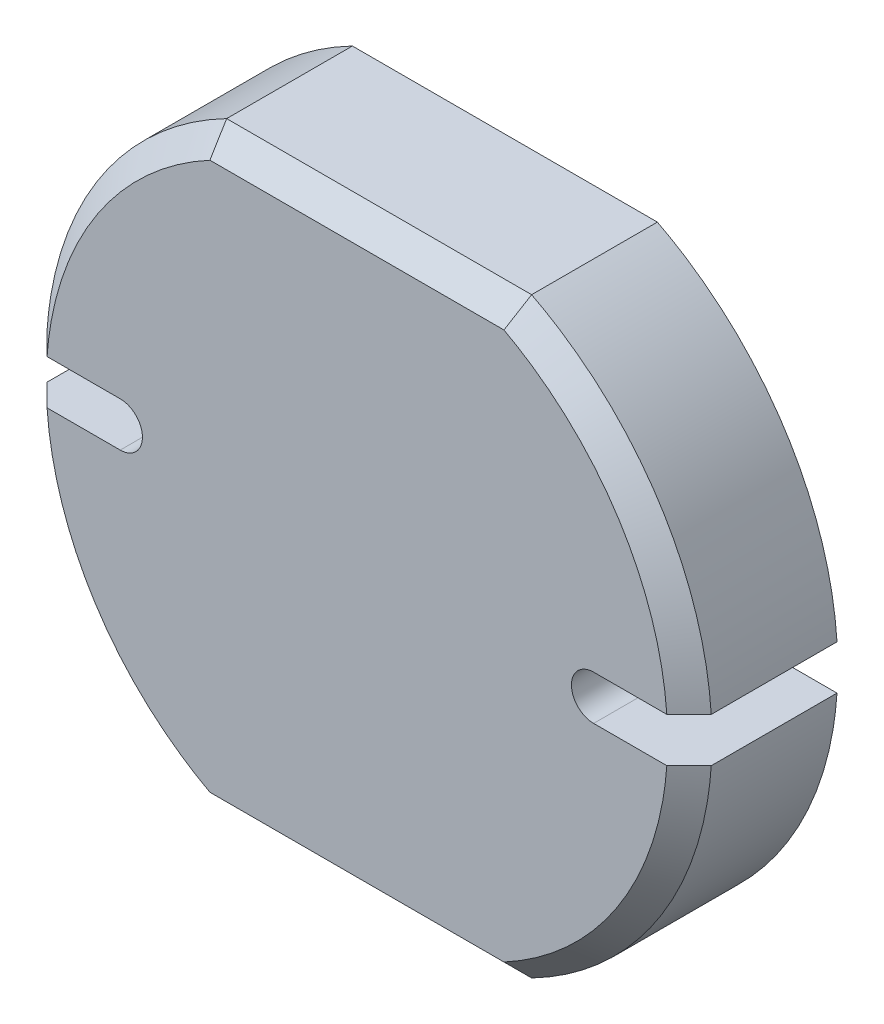
ISO-10303-21;
HEADER;
FILE_DESCRIPTION(('STEP AP214'),'2;1');
FILE_NAME('part.step','',(''),(''),'','','');
FILE_SCHEMA(('AUTOMOTIVE_DESIGN { 1 0 10303 214 1 1 1 1 }'));
ENDSEC;
DATA;
#1=APPLICATION_CONTEXT('core data for automotive mechanical design processes');
#2=APPLICATION_PROTOCOL_DEFINITION('international standard','automotive_design',2000,#1);
#3=PRODUCT_CONTEXT('',#1,'mechanical');
#4=PRODUCT('Part','Part','',(#3));
#5=PRODUCT_RELATED_PRODUCT_CATEGORY('part','',(#4));
#6=PRODUCT_DEFINITION_FORMATION('','',#4);
#7=PRODUCT_DEFINITION_CONTEXT('part definition',#1,'design');
#8=PRODUCT_DEFINITION('design','',#6,#7);
#9=PRODUCT_DEFINITION_SHAPE('','',#8);
#10=(LENGTH_UNIT() NAMED_UNIT(*) SI_UNIT(.MILLI.,.METRE.));
#11=(NAMED_UNIT(*) PLANE_ANGLE_UNIT() SI_UNIT($,.RADIAN.));
#12=(NAMED_UNIT(*) SI_UNIT($,.STERADIAN.) SOLID_ANGLE_UNIT());
#13=UNCERTAINTY_MEASURE_WITH_UNIT(LENGTH_MEASURE(1.E-05),#10,'distance_accuracy_value','');
#14=(GEOMETRIC_REPRESENTATION_CONTEXT(3) GLOBAL_UNCERTAINTY_ASSIGNED_CONTEXT((#13)) GLOBAL_UNIT_ASSIGNED_CONTEXT((#10,
#11,#12)) REPRESENTATION_CONTEXT('',''));
#15=CARTESIAN_POINT('',(0.,0.,0.));
#16=DIRECTION('',(0.,0.,1.));
#17=DIRECTION('',(1.,0.,0.));
#18=AXIS2_PLACEMENT_3D('',#15,#16,#17);
#19=CARTESIAN_POINT('',(-2.095328136594,0.139999999998,3.225));
#20=CARTESIAN_POINT('',(-2.244994432065,0.149999999998,3.075));
#21=CARTESIAN_POINT('',(-2.016262776784,1.32334195029,3.225));
#22=CARTESIAN_POINT('',(-2.160281546554,1.41786637531,3.075));
#23=CARTESIAN_POINT('',(-0.962057979311,1.866666666667,3.225));
#24=CARTESIAN_POINT('',(-1.030776406405,2.,3.075));
#25=(BOUNDED_SURFACE() B_SPLINE_SURFACE(2,1,((#19,#20),(#21,#22),(#23,#24)),.UNSPECIFIED.,.F.,
.F.,.F.) B_SPLINE_SURFACE_WITH_KNOTS((3,3),(2,2),(5.254987378455,6.28318530718),
(-0.212132034356,0.),
.UNSPECIFIED.) GEOMETRIC_REPRESENTATION_ITEM() RATIONAL_B_SPLINE_SURFACE(((1.,1.),
(0.87073616041,0.87073616041),(1.,1.))) REPRESENTATION_ITEM('') SURFACE());
#26=CARTESIAN_POINT('',(-1.030776406404,2.,3.075));
#27=CARTESIAN_POINT('',(-1.012253376061,1.923627589388,3.151372410612));
#28=CARTESIAN_POINT('',(-0.993730345718,1.85,3.225));
#29=(BOUNDED_CURVE() B_SPLINE_CURVE(2,(#26,#27,#28),.UNSPECIFIED.,.F.,
.F.) B_SPLINE_CURVE_WITH_KNOTS((3,3),(-1.030776406404,-0.993730345718),
.UNSPECIFIED.) CURVE() GEOMETRIC_REPRESENTATION_ITEM() RATIONAL_B_SPLINE_CURVE((1.,1.,1.)) REPRESENTATION_ITEM(''));
#30=CARTESIAN_POINT('',(-1.030776406404,2.,3.075));
#31=VERTEX_POINT('',#30);
#32=CARTESIAN_POINT('',(-0.993730345718,1.85,3.225));
#33=VERTEX_POINT('',#32);
#34=EDGE_CURVE('E11',#31,#33,#29,.T.);
#35=CARTESIAN_POINT('',(-1.030776406405,2.,3.075));
#36=CARTESIAN_POINT('',(-2.160281546554,1.41786637531,3.075));
#37=CARTESIAN_POINT('',(-2.244994432064,0.149999999998,3.075));
#38=(BOUNDED_CURVE() B_SPLINE_CURVE(2,(#35,#36,#37),.UNSPECIFIED.,.F.,
.F.) B_SPLINE_CURVE_WITH_KNOTS((3,3),(0.,1.028197928725),
.UNSPECIFIED.) CURVE() GEOMETRIC_REPRESENTATION_ITEM() RATIONAL_B_SPLINE_CURVE((1.,
0.87073616041,1.)) REPRESENTATION_ITEM(''));
#39=CARTESIAN_POINT('',(-2.244994432064,0.149999999998,3.075));
#40=VERTEX_POINT('',#39);
#41=EDGE_CURVE('E299',#31,#40,#38,.T.);
#42=CARTESIAN_POINT('',(-2.244994432064,0.149999999998,3.075));
#43=CARTESIAN_POINT('',(-2.167222832668,0.149999999998,3.152598581163));
#44=CARTESIAN_POINT('',(-2.094636006565,0.149999999998,3.225));
#45=(BOUNDED_CURVE() B_SPLINE_CURVE(2,(#42,#43,#44),.UNSPECIFIED.,.F.,
.F.) B_SPLINE_CURVE_WITH_KNOTS((3,3),(-3.400084414127,-3.330926552655),
.UNSPECIFIED.) CURVE() GEOMETRIC_REPRESENTATION_ITEM() RATIONAL_B_SPLINE_CURVE((1.,
1.000597910799,1.)) REPRESENTATION_ITEM(''));
#46=CARTESIAN_POINT('',(-2.094636006565,0.149999999998,3.225));
#47=VERTEX_POINT('',#46);
#48=EDGE_CURVE('E46',#40,#47,#45,.T.);
#49=CARTESIAN_POINT('',(-0.993730345718,1.85,3.225));
#50=CARTESIAN_POINT('',(-2.012068082003,1.302998318521,3.225));
#51=CARTESIAN_POINT('',(-2.094636006565,0.149999999998,3.225));
#52=(BOUNDED_CURVE() B_SPLINE_CURVE(2,(#49,#50,#51),.UNSPECIFIED.,.F.,
.F.) B_SPLINE_CURVE_WITH_KNOTS((3,3),(0.01704301332499,1.02342462725),
.UNSPECIFIED.) CURVE() GEOMETRIC_REPRESENTATION_ITEM() RATIONAL_B_SPLINE_CURVE((1.,0.8760483427,1.)) REPRESENTATION_ITEM(''));
#53=EDGE_CURVE('E259',#33,#47,#52,.T.);
#54=ORIENTED_EDGE('',*,*,#34,.F.);
#55=ORIENTED_EDGE('',*,*,#41,.T.);
#56=ORIENTED_EDGE('',*,*,#48,.T.);
#57=ORIENTED_EDGE('',*,*,#53,.F.);
#58=EDGE_LOOP('',(#54,#55,#56,#57));
#59=FACE_BOUND('',#58,.T.);
#60=ADVANCED_FACE('F17',(#59),#25,.T.);
#61=CARTESIAN_POINT('',(1.030776406404,2.,3.075));
#62=CARTESIAN_POINT('',(1.030776406404,1.85,3.225));
#63=CARTESIAN_POINT('',(-1.030776406404,2.,3.075));
#64=CARTESIAN_POINT('',(-1.030776406404,1.85,3.225));
#65=(BOUNDED_SURFACE() B_SPLINE_SURFACE(1,1,((#61,#62),(#63,#64)),.UNSPECIFIED.,.F.,.F.,
.F.) B_SPLINE_SURFACE_WITH_KNOTS((2,2),(2,2),(-2.061552812808,4.11670697531E-13),
(-0.106066017178,0.106066017178),
.UNSPECIFIED.) GEOMETRIC_REPRESENTATION_ITEM() RATIONAL_B_SPLINE_SURFACE(((1.,1.),(1.,1.))) REPRESENTATION_ITEM('') SURFACE());
#66=CARTESIAN_POINT('',(-0.993730345718,1.85,3.225));
#67=CARTESIAN_POINT('',(0.993730345718,1.85,3.225));
#68=(BOUNDED_CURVE() B_SPLINE_CURVE(1,(#66,#67),.UNSPECIFIED.,.F.,
.F.) B_SPLINE_CURVE_WITH_KNOTS((2,2),(0.037046060686,2.024506752122),
.UNSPECIFIED.) CURVE() GEOMETRIC_REPRESENTATION_ITEM() RATIONAL_B_SPLINE_CURVE((1.,1.)) REPRESENTATION_ITEM(''));
#69=CARTESIAN_POINT('',(0.993730345718,1.85,3.225));
#70=VERTEX_POINT('',#69);
#71=EDGE_CURVE('E376',#33,#70,#68,.T.);
#72=CARTESIAN_POINT('',(1.030776406404,2.,3.075));
#73=CARTESIAN_POINT('',(1.012253376061,1.923627589388,3.151372410612));
#74=CARTESIAN_POINT('',(0.993730345718,1.85,3.225));
#75=(BOUNDED_CURVE() B_SPLINE_CURVE(2,(#72,#73,#74),.UNSPECIFIED.,.F.,
.F.) B_SPLINE_CURVE_WITH_KNOTS((3,3),(-1.030776406404,-0.993730345718),
.UNSPECIFIED.) CURVE() GEOMETRIC_REPRESENTATION_ITEM() RATIONAL_B_SPLINE_CURVE((1.,1.,1.)) REPRESENTATION_ITEM(''));
#76=CARTESIAN_POINT('',(1.030776406404,2.,3.075));
#77=VERTEX_POINT('',#76);
#78=EDGE_CURVE('E32',#77,#70,#75,.T.);
#79=CARTESIAN_POINT('',(-1.030776406404,2.,3.075));
#80=CARTESIAN_POINT('',(1.030776406404,2.,3.075));
#81=(BOUNDED_CURVE() B_SPLINE_CURVE(1,(#79,#80),.UNSPECIFIED.,.F.,
.F.) B_SPLINE_CURVE_WITH_KNOTS((2,2),(0.,2.061552812808),
.UNSPECIFIED.) CURVE() GEOMETRIC_REPRESENTATION_ITEM() RATIONAL_B_SPLINE_CURVE((1.,1.)) REPRESENTATION_ITEM(''));
#82=EDGE_CURVE('E242',#31,#77,#81,.T.);
#83=ORIENTED_EDGE('',*,*,#71,.T.);
#84=ORIENTED_EDGE('',*,*,#78,.F.);
#85=ORIENTED_EDGE('',*,*,#82,.F.);
#86=ORIENTED_EDGE('',*,*,#34,.T.);
#87=EDGE_LOOP('',(#83,#84,#85,#86));
#88=FACE_BOUND('',#87,.T.);
#89=ADVANCED_FACE('F464',(#88),#65,.T.);
#90=CARTESIAN_POINT('',(0.962057979311,1.866666666667,3.225));
#91=CARTESIAN_POINT('',(1.030776406404,2.,3.075));
#92=CARTESIAN_POINT('',(2.016262776784,1.32334195029,3.225));
#93=CARTESIAN_POINT('',(2.160281546554,1.417866375311,3.075));
#94=CARTESIAN_POINT('',(2.095328136594,0.139999999998,3.225));
#95=CARTESIAN_POINT('',(2.244994432064,0.149999999998,3.075));
#96=(BOUNDED_SURFACE() B_SPLINE_SURFACE(2,1,((#90,#91),(#92,#93),(#94,#95)),.UNSPECIFIED.,.F.,
.F.,.F.) B_SPLINE_SURFACE_WITH_KNOTS((3,3),(2,2),(5.254987378454,6.28318530718),
(-0.212132034356,0.),
.UNSPECIFIED.) GEOMETRIC_REPRESENTATION_ITEM() RATIONAL_B_SPLINE_SURFACE(((1.,1.),
(0.87073616041,0.87073616041),(1.,1.))) REPRESENTATION_ITEM('') SURFACE());
#97=CARTESIAN_POINT('',(2.244994432064,0.15,3.075));
#98=CARTESIAN_POINT('',(2.167222832668,0.15,3.152598581163));
#99=CARTESIAN_POINT('',(2.094636006565,0.15,3.225));
#100=(BOUNDED_CURVE() B_SPLINE_CURVE(2,(#97,#98,#99),.UNSPECIFIED.,.F.,
.F.) B_SPLINE_CURVE_WITH_KNOTS((3,3),(-3.400084414113,-3.330926552641),
.UNSPECIFIED.) CURVE() GEOMETRIC_REPRESENTATION_ITEM() RATIONAL_B_SPLINE_CURVE((1.,
1.000597910799,1.)) REPRESENTATION_ITEM(''));
#101=CARTESIAN_POINT('',(2.244994432064,0.149999999998,3.075));
#102=VERTEX_POINT('',#101);
#103=CARTESIAN_POINT('',(2.094636006565,0.15,3.225));
#104=VERTEX_POINT('',#103);
#105=EDGE_CURVE('E385',#102,#104,#100,.T.);
#106=CARTESIAN_POINT('',(2.244994432064,0.149999999998,3.075));
#107=CARTESIAN_POINT('',(2.160281546554,1.417866375311,3.075));
#108=CARTESIAN_POINT('',(1.030776406404,2.,3.075));
#109=(BOUNDED_CURVE() B_SPLINE_CURVE(2,(#106,#107,#108),.UNSPECIFIED.,.F.,
.F.) B_SPLINE_CURVE_WITH_KNOTS((3,3),(0.,1.028197928725),
.UNSPECIFIED.) CURVE() GEOMETRIC_REPRESENTATION_ITEM() RATIONAL_B_SPLINE_CURVE((1.,
0.87073616041,1.)) REPRESENTATION_ITEM(''));
#110=EDGE_CURVE('E576',#102,#77,#109,.T.);
#111=CARTESIAN_POINT('',(2.094636006565,0.15,3.225));
#112=CARTESIAN_POINT('',(2.012068082002,1.302998318521,3.225));
#113=CARTESIAN_POINT('',(0.993730345718,1.85,3.225));
#114=(BOUNDED_CURVE() B_SPLINE_CURVE(2,(#111,#112,#113),.UNSPECIFIED.,.F.,
.F.) B_SPLINE_CURVE_WITH_KNOTS((3,3),(0.004773301476031,1.0111549154),
.UNSPECIFIED.) CURVE() GEOMETRIC_REPRESENTATION_ITEM() RATIONAL_B_SPLINE_CURVE((1.,0.8760483427,1.)) REPRESENTATION_ITEM(''));
#115=EDGE_CURVE('E269',#104,#70,#114,.T.);
#116=ORIENTED_EDGE('',*,*,#105,.F.);
#117=ORIENTED_EDGE('',*,*,#110,.T.);
#118=ORIENTED_EDGE('',*,*,#78,.T.);
#119=ORIENTED_EDGE('',*,*,#115,.F.);
#120=EDGE_LOOP('',(#116,#117,#118,#119));
#121=FACE_BOUND('',#120,.T.);
#122=ADVANCED_FACE('F19',(#121),#96,.T.);
#123=CARTESIAN_POINT('',(2.095328136594,-0.139999999998,3.225));
#124=CARTESIAN_POINT('',(2.244994432065,-0.149999999998,3.075));
#125=CARTESIAN_POINT('',(2.016262776784,-1.32334195029,3.225));
#126=CARTESIAN_POINT('',(2.160281546554,-1.41786637531,3.075));
#127=CARTESIAN_POINT('',(0.962057979311,-1.866666666667,3.225));
#128=CARTESIAN_POINT('',(1.030776406405,-2.,3.075));
#129=(BOUNDED_SURFACE() B_SPLINE_SURFACE(2,1,((#123,#124),(#125,#126),(#127,#128)),
.UNSPECIFIED.,.F.,.F.,.F.) B_SPLINE_SURFACE_WITH_KNOTS((3,3),(2,2),(5.254987378455,
6.28318530718),(-0.212132034356,0.),
.UNSPECIFIED.) GEOMETRIC_REPRESENTATION_ITEM() RATIONAL_B_SPLINE_SURFACE(((1.,1.),
(0.87073616041,0.87073616041),(1.,1.))) REPRESENTATION_ITEM('') SURFACE());
#130=CARTESIAN_POINT('',(1.030776406404,-2.,3.075));
#131=CARTESIAN_POINT('',(1.012253376061,-1.923627589388,3.151372410612));
#132=CARTESIAN_POINT('',(0.993730345718,-1.85,3.225));
#133=(BOUNDED_CURVE() B_SPLINE_CURVE(2,(#130,#131,#132),.UNSPECIFIED.,.F.,
.F.) B_SPLINE_CURVE_WITH_KNOTS((3,3),(-1.030776406404,-0.993730345718),
.UNSPECIFIED.) CURVE() GEOMETRIC_REPRESENTATION_ITEM() RATIONAL_B_SPLINE_CURVE((1.,1.,1.)) REPRESENTATION_ITEM(''));
#134=CARTESIAN_POINT('',(1.030776406404,-2.,3.075));
#135=VERTEX_POINT('',#134);
#136=CARTESIAN_POINT('',(0.993730345718,-1.85,3.225));
#137=VERTEX_POINT('',#136);
#138=EDGE_CURVE('E549',#135,#137,#133,.T.);
#139=CARTESIAN_POINT('',(1.030776406405,-2.,3.075));
#140=CARTESIAN_POINT('',(2.160281546554,-1.41786637531,3.075));
#141=CARTESIAN_POINT('',(2.244994432064,-0.149999999998,3.075));
#142=(BOUNDED_CURVE() B_SPLINE_CURVE(2,(#139,#140,#141),.UNSPECIFIED.,.F.,
.F.) B_SPLINE_CURVE_WITH_KNOTS((3,3),(0.,1.028197928725),
.UNSPECIFIED.) CURVE() GEOMETRIC_REPRESENTATION_ITEM() RATIONAL_B_SPLINE_CURVE((1.,
0.87073616041,1.)) REPRESENTATION_ITEM(''));
#143=CARTESIAN_POINT('',(2.244994432064,-0.149999999998,3.075));
#144=VERTEX_POINT('',#143);
#145=EDGE_CURVE('E234',#135,#144,#142,.T.);
#146=CARTESIAN_POINT('',(2.244994432064,-0.15,3.075));
#147=CARTESIAN_POINT('',(2.167222832668,-0.15,3.152598581163));
#148=CARTESIAN_POINT('',(2.094636006565,-0.15,3.225));
#149=(BOUNDED_CURVE() B_SPLINE_CURVE(2,(#146,#147,#148),.UNSPECIFIED.,.F.,
.F.) B_SPLINE_CURVE_WITH_KNOTS((3,3),(-3.400084414113,-3.330926552641),
.UNSPECIFIED.) CURVE() GEOMETRIC_REPRESENTATION_ITEM() RATIONAL_B_SPLINE_CURVE((1.,
1.000597910799,1.)) REPRESENTATION_ITEM(''));
#150=CARTESIAN_POINT('',(2.094636006565,-0.15,3.225));
#151=VERTEX_POINT('',#150);
#152=EDGE_CURVE('E141',#144,#151,#149,.T.);
#153=CARTESIAN_POINT('',(0.993730345718,-1.85,3.225));
#154=CARTESIAN_POINT('',(2.012068082002,-1.302998318521,3.225));
#155=CARTESIAN_POINT('',(2.094636006565,-0.15,3.225));
#156=(BOUNDED_CURVE() B_SPLINE_CURVE(2,(#153,#154,#155),.UNSPECIFIED.,.F.,
.F.) B_SPLINE_CURVE_WITH_KNOTS((3,3),(0.01704301332499,1.023424627249),
.UNSPECIFIED.) CURVE() GEOMETRIC_REPRESENTATION_ITEM() RATIONAL_B_SPLINE_CURVE((1.,0.8760483427,1.)) REPRESENTATION_ITEM(''));
#157=EDGE_CURVE('E315',#137,#151,#156,.T.);
#158=ORIENTED_EDGE('',*,*,#138,.F.);
#159=ORIENTED_EDGE('',*,*,#145,.T.);
#160=ORIENTED_EDGE('',*,*,#152,.T.);
#161=ORIENTED_EDGE('',*,*,#157,.F.);
#162=EDGE_LOOP('',(#158,#159,#160,#161));
#163=FACE_BOUND('',#162,.T.);
#164=ADVANCED_FACE('F528',(#163),#129,.T.);
#165=CARTESIAN_POINT('',(-2.244994432076,0.149999999998,3.225));
#166=CARTESIAN_POINT('',(-2.244994432076,0.149999999998,2.225));
#167=CARTESIAN_POINT('',(-1.6,0.149999999998,3.225));
#168=CARTESIAN_POINT('',(-1.6,0.149999999998,2.225));
#169=(BOUNDED_SURFACE() B_SPLINE_SURFACE(1,1,((#165,#166),(#167,#168)),.UNSPECIFIED.,.F.,.F.,
.F.) B_SPLINE_SURFACE_WITH_KNOTS((2,2),(2,2),(1.200017862857E-11,0.644994432088),(-1.,0.),
.UNSPECIFIED.) GEOMETRIC_REPRESENTATION_ITEM() RATIONAL_B_SPLINE_SURFACE(((1.,1.),(1.,1.))) REPRESENTATION_ITEM('') SURFACE());
#170=CARTESIAN_POINT('',(-2.244994432076,0.149999999998,2.225));
#171=CARTESIAN_POINT('',(-1.6,0.149999999998,2.225));
#172=(BOUNDED_CURVE() B_SPLINE_CURVE(1,(#170,#171),.UNSPECIFIED.,.F.,
.F.) B_SPLINE_CURVE_WITH_KNOTS((2,2),(1.200017862857E-11,0.644994432088),
.UNSPECIFIED.) CURVE() GEOMETRIC_REPRESENTATION_ITEM() RATIONAL_B_SPLINE_CURVE((1.,1.)) REPRESENTATION_ITEM(''));
#173=CARTESIAN_POINT('',(-2.244994432076,0.149999999998,2.225));
#174=VERTEX_POINT('',#173);
#175=CARTESIAN_POINT('',(-1.6,0.149999999999,2.225));
#176=VERTEX_POINT('',#175);
#177=EDGE_CURVE('E360',#174,#176,#172,.T.);
#178=CARTESIAN_POINT('',(-1.6,0.149999999999,2.225));
#179=CARTESIAN_POINT('',(-1.6,0.149999999999,3.225));
#180=(BOUNDED_CURVE() B_SPLINE_CURVE(1,(#178,#179),.UNSPECIFIED.,.F.,
.F.) B_SPLINE_CURVE_WITH_KNOTS((2,2),(0.,1.),
.UNSPECIFIED.) CURVE() GEOMETRIC_REPRESENTATION_ITEM() RATIONAL_B_SPLINE_CURVE((1.,1.)) REPRESENTATION_ITEM(''));
#181=CARTESIAN_POINT('',(-1.6,0.149999999999,3.225));
#182=VERTEX_POINT('',#181);
#183=EDGE_CURVE('E176',#176,#182,#180,.T.);
#184=CARTESIAN_POINT('',(-2.094636006565,0.149999999998,3.225));
#185=CARTESIAN_POINT('',(-1.6,0.149999999998,3.225));
#186=(BOUNDED_CURVE() B_SPLINE_CURVE(1,(#184,#185),.UNSPECIFIED.,.F.,
.F.) B_SPLINE_CURVE_WITH_KNOTS((2,2),(0.150358425523,0.644994432088),
.UNSPECIFIED.) CURVE() GEOMETRIC_REPRESENTATION_ITEM() RATIONAL_B_SPLINE_CURVE((1.,1.)) REPRESENTATION_ITEM(''));
#187=EDGE_CURVE('E202',#47,#182,#186,.T.);
#188=CARTESIAN_POINT('',(-2.244994432076,0.149999999998,2.225));
#189=CARTESIAN_POINT('',(-2.244994432076,0.149999999998,3.075));
#190=(BOUNDED_CURVE() B_SPLINE_CURVE(1,(#188,#189),.UNSPECIFIED.,.F.,
.F.) B_SPLINE_CURVE_WITH_KNOTS((2,2),(0.,0.85),
.UNSPECIFIED.) CURVE() GEOMETRIC_REPRESENTATION_ITEM() RATIONAL_B_SPLINE_CURVE((1.,1.)) REPRESENTATION_ITEM(''));
#191=EDGE_CURVE('E182',#174,#40,#190,.T.);
#192=ORIENTED_EDGE('',*,*,#177,.T.);
#193=ORIENTED_EDGE('',*,*,#183,.T.);
#194=ORIENTED_EDGE('',*,*,#187,.F.);
#195=ORIENTED_EDGE('',*,*,#48,.F.);
#196=ORIENTED_EDGE('',*,*,#191,.F.);
#197=EDGE_LOOP('',(#192,#193,#194,#195,#196));
#198=FACE_BOUND('',#197,.T.);
#199=ADVANCED_FACE('F445',(#198),#169,.F.);
#200=CARTESIAN_POINT('',(-2.244994432065,0.149999999997,3.075));
#201=CARTESIAN_POINT('',(-2.244994432065,0.149999999997,2.225));
#202=CARTESIAN_POINT('',(-2.160281546555,1.417866375311,3.075));
#203=CARTESIAN_POINT('',(-2.160281546555,1.417866375311,2.225));
#204=CARTESIAN_POINT('',(-1.030776406404,2.,3.075));
#205=CARTESIAN_POINT('',(-1.030776406404,2.,2.225));
#206=(BOUNDED_SURFACE() B_SPLINE_SURFACE(2,1,((#200,#201),(#202,#203),(#204,#205)),
.UNSPECIFIED.,.F.,.F.,.F.) B_SPLINE_SURFACE_WITH_KNOTS((3,3),(2,2),(4.779105128794,
5.80730305752),(-0.85,0.),
.UNSPECIFIED.) GEOMETRIC_REPRESENTATION_ITEM() RATIONAL_B_SPLINE_SURFACE(((1.,1.),
(0.870736160409,0.870736160409),(1.,1.))) REPRESENTATION_ITEM('') SURFACE());
#207=CARTESIAN_POINT('',(-1.030776406404,2.,2.225));
#208=CARTESIAN_POINT('',(-2.160281546555,1.41786637531,2.225));
#209=CARTESIAN_POINT('',(-2.244994432065,0.149999999997,2.225));
#210=(BOUNDED_CURVE() B_SPLINE_CURVE(2,(#207,#208,#209),.UNSPECIFIED.,.F.,
.F.) B_SPLINE_CURVE_WITH_KNOTS((3,3),(0.47588224966,1.504080178386),
.UNSPECIFIED.) CURVE() GEOMETRIC_REPRESENTATION_ITEM() RATIONAL_B_SPLINE_CURVE((1.,
0.870736160409,1.)) REPRESENTATION_ITEM(''));
#211=CARTESIAN_POINT('',(-1.030776406404,2.,2.225));
#212=VERTEX_POINT('',#211);
#213=EDGE_CURVE('E361',#212,#174,#210,.T.);
#214=CARTESIAN_POINT('',(-1.030776406404,2.,2.225));
#215=CARTESIAN_POINT('',(-1.030776406404,2.,3.075));
#216=(BOUNDED_CURVE() B_SPLINE_CURVE(1,(#214,#215),.UNSPECIFIED.,.F.,
.F.) B_SPLINE_CURVE_WITH_KNOTS((2,2),(0.,0.85),
.UNSPECIFIED.) CURVE() GEOMETRIC_REPRESENTATION_ITEM() RATIONAL_B_SPLINE_CURVE((1.,1.)) REPRESENTATION_ITEM(''));
#217=EDGE_CURVE('E251',#212,#31,#216,.T.);
#218=ORIENTED_EDGE('',*,*,#213,.T.);
#219=ORIENTED_EDGE('',*,*,#191,.T.);
#220=ORIENTED_EDGE('',*,*,#41,.F.);
#221=ORIENTED_EDGE('',*,*,#217,.F.);
#222=EDGE_LOOP('',(#218,#219,#220,#221));
#223=FACE_BOUND('',#222,.T.);
#224=ADVANCED_FACE('F476',(#223),#206,.T.);
#225=CARTESIAN_POINT('',(-1.030776406404,2.,3.075));
#226=CARTESIAN_POINT('',(-1.030776406404,2.,2.225));
#227=CARTESIAN_POINT('',(1.030776406404,2.,3.075));
#228=CARTESIAN_POINT('',(1.030776406404,2.,2.225));
#229=(BOUNDED_SURFACE() B_SPLINE_SURFACE(1,1,((#225,#226),(#227,#228)),.UNSPECIFIED.,.F.,.F.,
.F.) B_SPLINE_SURFACE_WITH_KNOTS((2,2),(2,2),(0.,2.061552812808),(-0.85,0.),
.UNSPECIFIED.) GEOMETRIC_REPRESENTATION_ITEM() RATIONAL_B_SPLINE_SURFACE(((1.,1.),(1.,1.))) REPRESENTATION_ITEM('') SURFACE());
#230=CARTESIAN_POINT('',(1.030776406404,2.,2.225));
#231=CARTESIAN_POINT('',(1.030776406404,2.,3.075));
#232=(BOUNDED_CURVE() B_SPLINE_CURVE(1,(#230,#231),.UNSPECIFIED.,.F.,
.F.) B_SPLINE_CURVE_WITH_KNOTS((2,2),(0.,0.85),
.UNSPECIFIED.) CURVE() GEOMETRIC_REPRESENTATION_ITEM() RATIONAL_B_SPLINE_CURVE((1.,1.)) REPRESENTATION_ITEM(''));
#233=CARTESIAN_POINT('',(1.030776406404,2.,2.225));
#234=VERTEX_POINT('',#233);
#235=EDGE_CURVE('E400',#234,#77,#232,.T.);
#236=CARTESIAN_POINT('',(-1.030776406404,2.,2.225));
#237=CARTESIAN_POINT('',(1.030776406404,2.,2.225));
#238=(BOUNDED_CURVE() B_SPLINE_CURVE(1,(#236,#237),.UNSPECIFIED.,.F.,
.F.) B_SPLINE_CURVE_WITH_KNOTS((2,2),(0.,2.061552812808),
.UNSPECIFIED.) CURVE() GEOMETRIC_REPRESENTATION_ITEM() RATIONAL_B_SPLINE_CURVE((1.,1.)) REPRESENTATION_ITEM(''));
#239=EDGE_CURVE('E281',#212,#234,#238,.T.);
#240=ORIENTED_EDGE('',*,*,#217,.T.);
#241=ORIENTED_EDGE('',*,*,#82,.T.);
#242=ORIENTED_EDGE('',*,*,#235,.F.);
#243=ORIENTED_EDGE('',*,*,#239,.F.);
#244=EDGE_LOOP('',(#240,#241,#242,#243));
#245=FACE_BOUND('',#244,.T.);
#246=ADVANCED_FACE('F490',(#245),#229,.T.);
#247=CARTESIAN_POINT('',(1.030776406404,2.,3.075));
#248=CARTESIAN_POINT('',(1.030776406404,2.,2.225));
#249=CARTESIAN_POINT('',(2.160281546554,1.417866375311,3.075));
#250=CARTESIAN_POINT('',(2.160281546554,1.417866375311,2.225));
#251=CARTESIAN_POINT('',(2.244994432065,0.149999999998,3.075));
#252=CARTESIAN_POINT('',(2.244994432065,0.149999999998,2.225));
#253=(BOUNDED_SURFACE() B_SPLINE_SURFACE(2,1,((#247,#248),(#249,#250),(#251,#252)),
.UNSPECIFIED.,.F.,.F.,.F.) B_SPLINE_SURFACE_WITH_KNOTS((3,3),(2,2),(0.47588224966,
1.504080178386),(-0.85,0.),
.UNSPECIFIED.) GEOMETRIC_REPRESENTATION_ITEM() RATIONAL_B_SPLINE_SURFACE(((1.,1.),
(0.870736160409,0.870736160409),(1.,1.))) REPRESENTATION_ITEM('') SURFACE());
#254=CARTESIAN_POINT('',(2.244994432064,0.149999999999,2.225));
#255=CARTESIAN_POINT('',(2.160281546554,1.417866375311,2.225));
#256=CARTESIAN_POINT('',(1.030776406404,2.,2.225));
#257=(BOUNDED_CURVE() B_SPLINE_CURVE(2,(#254,#255,#256),.UNSPECIFIED.,.F.,
.F.) B_SPLINE_CURVE_WITH_KNOTS((3,3),(4.779105128794,5.807303057519),
.UNSPECIFIED.) CURVE() GEOMETRIC_REPRESENTATION_ITEM() RATIONAL_B_SPLINE_CURVE((1.,
0.87073616041,1.)) REPRESENTATION_ITEM(''));
#258=CARTESIAN_POINT('',(2.244994432064,0.149999999999,2.225));
#259=VERTEX_POINT('',#258);
#260=EDGE_CURVE('E271',#259,#234,#257,.T.);
#261=CARTESIAN_POINT('',(2.244994432064,0.149999999999,2.225));
#262=CARTESIAN_POINT('',(2.244994432064,0.149999999999,3.075));
#263=(BOUNDED_CURVE() B_SPLINE_CURVE(1,(#261,#262),.UNSPECIFIED.,.F.,
.F.) B_SPLINE_CURVE_WITH_KNOTS((2,2),(0.,0.85),
.UNSPECIFIED.) CURVE() GEOMETRIC_REPRESENTATION_ITEM() RATIONAL_B_SPLINE_CURVE((1.,1.)) REPRESENTATION_ITEM(''));
#264=EDGE_CURVE('E377',#259,#102,#263,.T.);
#265=ORIENTED_EDGE('',*,*,#260,.T.);
#266=ORIENTED_EDGE('',*,*,#235,.T.);
#267=ORIENTED_EDGE('',*,*,#110,.F.);
#268=ORIENTED_EDGE('',*,*,#264,.F.);
#269=EDGE_LOOP('',(#265,#266,#267,#268));
#270=FACE_BOUND('',#269,.T.);
#271=ADVANCED_FACE('F479',(#270),#253,.T.);
#272=CARTESIAN_POINT('',(2.244994432064,0.15,3.225));
#273=CARTESIAN_POINT('',(2.244994432064,0.15,2.225));
#274=CARTESIAN_POINT('',(1.6,0.15,3.225));
#275=CARTESIAN_POINT('',(1.6,0.15,2.225));
#276=(BOUNDED_SURFACE() B_SPLINE_SURFACE(1,1,((#272,#273),(#274,#275)),.UNSPECIFIED.,.F.,.F.,
.F.) B_SPLINE_SURFACE_WITH_KNOTS((2,2),(2,2),(-1.816324868287E-13,0.644994432064),(-1.,0.),
.UNSPECIFIED.) GEOMETRIC_REPRESENTATION_ITEM() RATIONAL_B_SPLINE_SURFACE(((1.,1.),(1.,1.))) REPRESENTATION_ITEM('') SURFACE());
#277=CARTESIAN_POINT('',(2.094636006565,0.15,3.225));
#278=CARTESIAN_POINT('',(1.6,0.15,3.225));
#279=(BOUNDED_CURVE() B_SPLINE_CURVE(1,(#277,#278),.UNSPECIFIED.,.F.,
.F.) B_SPLINE_CURVE_WITH_KNOTS((2,2),(0.150358425499,0.644994432064),
.UNSPECIFIED.) CURVE() GEOMETRIC_REPRESENTATION_ITEM() RATIONAL_B_SPLINE_CURVE((1.,1.)) REPRESENTATION_ITEM(''));
#280=CARTESIAN_POINT('',(1.6,0.15,3.225));
#281=VERTEX_POINT('',#280);
#282=EDGE_CURVE('E260',#104,#281,#279,.T.);
#283=CARTESIAN_POINT('',(1.6,0.15,2.225));
#284=CARTESIAN_POINT('',(1.6,0.15,3.225));
#285=(BOUNDED_CURVE() B_SPLINE_CURVE(1,(#283,#284),.UNSPECIFIED.,.F.,
.F.) B_SPLINE_CURVE_WITH_KNOTS((2,2),(0.,1.),
.UNSPECIFIED.) CURVE() GEOMETRIC_REPRESENTATION_ITEM() RATIONAL_B_SPLINE_CURVE((1.,1.)) REPRESENTATION_ITEM(''));
#286=CARTESIAN_POINT('',(1.6,0.15,2.225));
#287=VERTEX_POINT('',#286);
#288=EDGE_CURVE('E386',#287,#281,#285,.T.);
#289=CARTESIAN_POINT('',(2.244994432064,0.15,2.225));
#290=CARTESIAN_POINT('',(1.6,0.15,2.225));
#291=(BOUNDED_CURVE() B_SPLINE_CURVE(1,(#289,#290),.UNSPECIFIED.,.F.,
.F.) B_SPLINE_CURVE_WITH_KNOTS((2,2),(0.,0.644994432064),
.UNSPECIFIED.) CURVE() GEOMETRIC_REPRESENTATION_ITEM() RATIONAL_B_SPLINE_CURVE((1.,1.)) REPRESENTATION_ITEM(''));
#292=EDGE_CURVE('E280',#259,#287,#291,.T.);
#293=ORIENTED_EDGE('',*,*,#264,.T.);
#294=ORIENTED_EDGE('',*,*,#105,.T.);
#295=ORIENTED_EDGE('',*,*,#282,.T.);
#296=ORIENTED_EDGE('',*,*,#288,.F.);
#297=ORIENTED_EDGE('',*,*,#292,.F.);
#298=EDGE_LOOP('',(#293,#294,#295,#296,#297));
#299=FACE_BOUND('',#298,.T.);
#300=ADVANCED_FACE('F489',(#299),#276,.T.);
#301=CARTESIAN_POINT('',(1.6,-0.15,3.225));
#302=CARTESIAN_POINT('',(1.6,-0.15,2.225));
#303=CARTESIAN_POINT('',(1.45,-0.15,3.225));
#304=CARTESIAN_POINT('',(1.45,-0.15,2.225));
#305=CARTESIAN_POINT('',(1.45,0.,3.225));
#306=CARTESIAN_POINT('',(1.45,0.,2.225));
#307=CARTESIAN_POINT('',(1.45,0.15,3.225));
#308=CARTESIAN_POINT('',(1.45,0.15,2.225));
#309=CARTESIAN_POINT('',(1.6,0.15,3.225));
#310=CARTESIAN_POINT('',(1.6,0.15,2.225));
#311=(BOUNDED_SURFACE() B_SPLINE_SURFACE(2,1,((#301,#302),(#303,#304),(#305,#306),(#307,#308),
(#309,#310)),.UNSPECIFIED.,.F.,.F.,.F.) B_SPLINE_SURFACE_WITH_KNOTS((3,2,3),(2,2),
(3.14159265359,4.712388980385,6.28318530718),(-1.,0.),
.UNSPECIFIED.) GEOMETRIC_REPRESENTATION_ITEM() RATIONAL_B_SPLINE_SURFACE(((1.,1.),
(0.707106781187,0.707106781187),(1.,1.),(0.707106781187,0.707106781187),(1.,1.))) REPRESENTATION_ITEM('') SURFACE());
#312=CARTESIAN_POINT('',(1.6,0.15,3.225));
#313=CARTESIAN_POINT('',(1.45,0.15,3.225));
#314=CARTESIAN_POINT('',(1.45,0.,3.225));
#315=CARTESIAN_POINT('',(1.45,-0.15,3.225));
#316=CARTESIAN_POINT('',(1.6,-0.15,3.225));
#317=(BOUNDED_CURVE() B_SPLINE_CURVE(2,(#312,#313,#314,#315,#316),.UNSPECIFIED.,.F.,
.F.) B_SPLINE_CURVE_WITH_KNOTS((3,2,3),(0.,1.570796326795,3.14159265359),
.UNSPECIFIED.) CURVE() GEOMETRIC_REPRESENTATION_ITEM() RATIONAL_B_SPLINE_CURVE((1.,
0.707106781187,1.,0.707106781187,1.)) REPRESENTATION_ITEM(''));
#318=CARTESIAN_POINT('',(1.6,-0.15,3.225));
#319=VERTEX_POINT('',#318);
#320=EDGE_CURVE('E270',#281,#319,#317,.T.);
#321=CARTESIAN_POINT('',(1.6,-0.15,2.225));
#322=CARTESIAN_POINT('',(1.6,-0.15,3.225));
#323=(BOUNDED_CURVE() B_SPLINE_CURVE(1,(#321,#322),.UNSPECIFIED.,.F.,
.F.) B_SPLINE_CURVE_WITH_KNOTS((2,2),(0.,1.),
.UNSPECIFIED.) CURVE() GEOMETRIC_REPRESENTATION_ITEM() RATIONAL_B_SPLINE_CURVE((1.,1.)) REPRESENTATION_ITEM(''));
#324=CARTESIAN_POINT('',(1.6,-0.15,2.225));
#325=VERTEX_POINT('',#324);
#326=EDGE_CURVE('E126',#325,#319,#323,.T.);
#327=CARTESIAN_POINT('',(1.6,0.15,2.225));
#328=CARTESIAN_POINT('',(1.45,0.15,2.225));
#329=CARTESIAN_POINT('',(1.45,0.,2.225));
#330=CARTESIAN_POINT('',(1.45,-0.15,2.225));
#331=CARTESIAN_POINT('',(1.6,-0.15,2.225));
#332=(BOUNDED_CURVE() B_SPLINE_CURVE(2,(#327,#328,#329,#330,#331),.UNSPECIFIED.,.F.,
.F.) B_SPLINE_CURVE_WITH_KNOTS((3,2,3),(0.,1.570796326795,3.14159265359),
.UNSPECIFIED.) CURVE() GEOMETRIC_REPRESENTATION_ITEM() RATIONAL_B_SPLINE_CURVE((1.,
0.707106781187,1.,0.707106781187,1.)) REPRESENTATION_ITEM(''));
#333=EDGE_CURVE('E282',#287,#325,#332,.T.);
#334=ORIENTED_EDGE('',*,*,#288,.T.);
#335=ORIENTED_EDGE('',*,*,#320,.T.);
#336=ORIENTED_EDGE('',*,*,#326,.F.);
#337=ORIENTED_EDGE('',*,*,#333,.F.);
#338=EDGE_LOOP('',(#334,#335,#336,#337));
#339=FACE_BOUND('',#338,.T.);
#340=ADVANCED_FACE('F637',(#339),#311,.F.);
#341=CARTESIAN_POINT('',(2.244994432076,-0.15,3.225));
#342=CARTESIAN_POINT('',(2.244994432076,-0.15,2.225));
#343=CARTESIAN_POINT('',(1.6,-0.15,3.225));
#344=CARTESIAN_POINT('',(1.6,-0.15,2.225));
#345=(BOUNDED_SURFACE() B_SPLINE_SURFACE(1,1,((#341,#342),(#343,#344)),.UNSPECIFIED.,.F.,.F.,
.F.) B_SPLINE_SURFACE_WITH_KNOTS((2,2),(2,2),(1.200017862857E-11,0.644994432088),(-1.,0.),
.UNSPECIFIED.) GEOMETRIC_REPRESENTATION_ITEM() RATIONAL_B_SPLINE_SURFACE(((1.,1.),(1.,1.))) REPRESENTATION_ITEM('') SURFACE());
#346=CARTESIAN_POINT('',(2.244994432076,-0.15,2.225));
#347=CARTESIAN_POINT('',(1.6,-0.15,2.225));
#348=(BOUNDED_CURVE() B_SPLINE_CURVE(1,(#346,#347),.UNSPECIFIED.,.F.,
.F.) B_SPLINE_CURVE_WITH_KNOTS((2,2),(1.200017862857E-11,0.644994432088),
.UNSPECIFIED.) CURVE() GEOMETRIC_REPRESENTATION_ITEM() RATIONAL_B_SPLINE_CURVE((1.,1.)) REPRESENTATION_ITEM(''));
#349=CARTESIAN_POINT('',(2.244994432076,-0.149999999999,2.225));
#350=VERTEX_POINT('',#349);
#351=EDGE_CURVE('E291',#350,#325,#348,.T.);
#352=CARTESIAN_POINT('',(2.094636006565,-0.15,3.225));
#353=CARTESIAN_POINT('',(1.6,-0.15,3.225));
#354=(BOUNDED_CURVE() B_SPLINE_CURVE(1,(#352,#353),.UNSPECIFIED.,.F.,
.F.) B_SPLINE_CURVE_WITH_KNOTS((2,2),(0.150358425523,0.644994432088),
.UNSPECIFIED.) CURVE() GEOMETRIC_REPRESENTATION_ITEM() RATIONAL_B_SPLINE_CURVE((1.,1.)) REPRESENTATION_ITEM(''));
#355=EDGE_CURVE('E420',#151,#319,#354,.T.);
#356=CARTESIAN_POINT('',(2.244994432076,-0.149999999999,2.225));
#357=CARTESIAN_POINT('',(2.244994432076,-0.149999999999,3.075));
#358=(BOUNDED_CURVE() B_SPLINE_CURVE(1,(#356,#357),.UNSPECIFIED.,.F.,
.F.) B_SPLINE_CURVE_WITH_KNOTS((2,2),(0.,0.85),
.UNSPECIFIED.) CURVE() GEOMETRIC_REPRESENTATION_ITEM() RATIONAL_B_SPLINE_CURVE((1.,1.)) REPRESENTATION_ITEM(''));
#359=EDGE_CURVE('E241',#350,#144,#358,.T.);
#360=ORIENTED_EDGE('',*,*,#351,.T.);
#361=ORIENTED_EDGE('',*,*,#326,.T.);
#362=ORIENTED_EDGE('',*,*,#355,.F.);
#363=ORIENTED_EDGE('',*,*,#152,.F.);
#364=ORIENTED_EDGE('',*,*,#359,.F.);
#365=EDGE_LOOP('',(#360,#361,#362,#363,#364));
#366=FACE_BOUND('',#365,.T.);
#367=ADVANCED_FACE('F636',(#366),#345,.F.);
#368=CARTESIAN_POINT('',(2.244994432064,-0.149999999998,3.075));
#369=CARTESIAN_POINT('',(2.244994432064,-0.149999999998,2.225));
#370=CARTESIAN_POINT('',(2.160281546554,-1.417866375311,3.075));
#371=CARTESIAN_POINT('',(2.160281546554,-1.417866375311,2.225));
#372=CARTESIAN_POINT('',(1.030776406404,-2.,3.075));
#373=CARTESIAN_POINT('',(1.030776406404,-2.,2.225));
#374=(BOUNDED_SURFACE() B_SPLINE_SURFACE(2,1,((#368,#369),(#370,#371),(#372,#373)),
.UNSPECIFIED.,.F.,.F.,.F.) B_SPLINE_SURFACE_WITH_KNOTS((3,3),(2,2),(1.637512475204,
2.66571040393),(-0.85,0.),
.UNSPECIFIED.) GEOMETRIC_REPRESENTATION_ITEM() RATIONAL_B_SPLINE_SURFACE(((1.,1.),
(0.870736160409,0.870736160409),(1.,1.))) REPRESENTATION_ITEM('') SURFACE());
#375=CARTESIAN_POINT('',(1.030776406404,-2.,2.225));
#376=CARTESIAN_POINT('',(2.160281546554,-1.417866375311,2.225));
#377=CARTESIAN_POINT('',(2.244994432064,-0.149999999998,2.225));
#378=(BOUNDED_CURVE() B_SPLINE_CURVE(2,(#375,#376,#377),.UNSPECIFIED.,.F.,
.F.) B_SPLINE_CURVE_WITH_KNOTS((3,3),(3.61747490325,4.645672831975),
.UNSPECIFIED.) CURVE() GEOMETRIC_REPRESENTATION_ITEM() RATIONAL_B_SPLINE_CURVE((1.,
0.870736160409,1.)) REPRESENTATION_ITEM(''));
#379=CARTESIAN_POINT('',(1.030776406404,-2.,2.225));
#380=VERTEX_POINT('',#379);
#381=EDGE_CURVE('E307',#380,#350,#378,.T.);
#382=CARTESIAN_POINT('',(1.030776406404,-2.,2.225));
#383=CARTESIAN_POINT('',(1.030776406404,-2.,3.075));
#384=(BOUNDED_CURVE() B_SPLINE_CURVE(1,(#382,#383),.UNSPECIFIED.,.F.,
.F.) B_SPLINE_CURVE_WITH_KNOTS((2,2),(0.,0.85),
.UNSPECIFIED.) CURVE() GEOMETRIC_REPRESENTATION_ITEM() RATIONAL_B_SPLINE_CURVE((1.,1.)) REPRESENTATION_ITEM(''));
#385=EDGE_CURVE('E23',#380,#135,#384,.T.);
#386=ORIENTED_EDGE('',*,*,#381,.T.);
#387=ORIENTED_EDGE('',*,*,#359,.T.);
#388=ORIENTED_EDGE('',*,*,#145,.F.);
#389=ORIENTED_EDGE('',*,*,#385,.F.);
#390=EDGE_LOOP('',(#386,#387,#388,#389));
#391=FACE_BOUND('',#390,.T.);
#392=ADVANCED_FACE('F502',(#391),#374,.T.);
#393=CARTESIAN_POINT('',(1.030776406404,-2.,3.075));
#394=CARTESIAN_POINT('',(1.030776406404,-1.85,3.225));
#395=CARTESIAN_POINT('',(-1.030776406404,-2.,3.075));
#396=CARTESIAN_POINT('',(-1.030776406404,-1.85,3.225));
#397=(BOUNDED_SURFACE() B_SPLINE_SURFACE(1,1,((#393,#394),(#395,#396)),.UNSPECIFIED.,.F.,.F.,
.F.) B_SPLINE_SURFACE_WITH_KNOTS((2,2),(2,2),(-2.061552812808,4.121147867409E-13),
(-0.106066017178,0.106066017178),
.UNSPECIFIED.) GEOMETRIC_REPRESENTATION_ITEM() RATIONAL_B_SPLINE_SURFACE(((1.,1.),(1.,1.))) REPRESENTATION_ITEM('') SURFACE());
#398=CARTESIAN_POINT('',(-1.030776406404,-2.,3.075));
#399=CARTESIAN_POINT('',(-1.012253376061,-1.923627589388,3.151372410612));
#400=CARTESIAN_POINT('',(-0.993730345718,-1.85,3.225));
#401=(BOUNDED_CURVE() B_SPLINE_CURVE(2,(#398,#399,#400),.UNSPECIFIED.,.F.,
.F.) B_SPLINE_CURVE_WITH_KNOTS((3,3),(-1.030776406404,-0.993730345718),
.UNSPECIFIED.) CURVE() GEOMETRIC_REPRESENTATION_ITEM() RATIONAL_B_SPLINE_CURVE((1.,1.,1.)) REPRESENTATION_ITEM(''));
#402=CARTESIAN_POINT('',(-1.030776406404,-2.,3.075));
#403=VERTEX_POINT('',#402);
#404=CARTESIAN_POINT('',(-0.993730345718,-1.85,3.225));
#405=VERTEX_POINT('',#404);
#406=EDGE_CURVE('E328',#403,#405,#401,.T.);
#407=CARTESIAN_POINT('',(-1.030776406404,-2.,3.075));
#408=CARTESIAN_POINT('',(1.030776406404,-2.,3.075));
#409=(BOUNDED_CURVE() B_SPLINE_CURVE(1,(#407,#408),.UNSPECIFIED.,.F.,
.F.) B_SPLINE_CURVE_WITH_KNOTS((2,2),(0.,2.061552812808),
.UNSPECIFIED.) CURVE() GEOMETRIC_REPRESENTATION_ITEM() RATIONAL_B_SPLINE_CURVE((1.,1.)) REPRESENTATION_ITEM(''));
#410=EDGE_CURVE('E411',#403,#135,#409,.T.);
#411=CARTESIAN_POINT('',(-0.993730345718,-1.85,3.225));
#412=CARTESIAN_POINT('',(0.993730345718,-1.85,3.225));
#413=(BOUNDED_CURVE() B_SPLINE_CURVE(1,(#411,#412),.UNSPECIFIED.,.F.,
.F.) B_SPLINE_CURVE_WITH_KNOTS((2,2),(0.037046060686,2.024506752122),
.UNSPECIFIED.) CURVE() GEOMETRIC_REPRESENTATION_ITEM() RATIONAL_B_SPLINE_CURVE((1.,1.)) REPRESENTATION_ITEM(''));
#414=EDGE_CURVE('E169',#405,#137,#413,.T.);
#415=ORIENTED_EDGE('',*,*,#406,.F.);
#416=ORIENTED_EDGE('',*,*,#410,.T.);
#417=ORIENTED_EDGE('',*,*,#138,.T.);
#418=ORIENTED_EDGE('',*,*,#414,.F.);
#419=EDGE_LOOP('',(#415,#416,#417,#418));
#420=FACE_BOUND('',#419,.T.);
#421=ADVANCED_FACE('F492',(#420),#397,.F.);
#422=CARTESIAN_POINT('',(-1.6,0.15,3.225));
#423=CARTESIAN_POINT('',(-1.6,0.15,2.225));
#424=CARTESIAN_POINT('',(-1.45,0.15,3.225));
#425=CARTESIAN_POINT('',(-1.45,0.15,2.225));
#426=CARTESIAN_POINT('',(-1.45,0.,3.225));
#427=CARTESIAN_POINT('',(-1.45,0.,2.225));
#428=CARTESIAN_POINT('',(-1.45,-0.15,3.225));
#429=CARTESIAN_POINT('',(-1.45,-0.15,2.225));
#430=CARTESIAN_POINT('',(-1.6,-0.15,3.225));
#431=CARTESIAN_POINT('',(-1.6,-0.15,2.225));
#432=(BOUNDED_SURFACE() B_SPLINE_SURFACE(2,1,((#422,#423),(#424,#425),(#426,#427),(#428,#429),
(#430,#431)),.UNSPECIFIED.,.F.,.F.,.F.) B_SPLINE_SURFACE_WITH_KNOTS((3,2,3),(2,2),(0.,
1.570796326795,3.14159265359),(-1.,0.),
.UNSPECIFIED.) GEOMETRIC_REPRESENTATION_ITEM() RATIONAL_B_SPLINE_SURFACE(((1.,1.),
(0.707106781187,0.707106781187),(1.,1.),(0.707106781187,0.707106781187),(1.,1.))) REPRESENTATION_ITEM('') SURFACE());
#433=CARTESIAN_POINT('',(-1.6,-0.15,2.225));
#434=CARTESIAN_POINT('',(-1.6,-0.15,3.225));
#435=(BOUNDED_CURVE() B_SPLINE_CURVE(1,(#433,#434),.UNSPECIFIED.,.F.,
.F.) B_SPLINE_CURVE_WITH_KNOTS((2,2),(0.,1.),
.UNSPECIFIED.) CURVE() GEOMETRIC_REPRESENTATION_ITEM() RATIONAL_B_SPLINE_CURVE((1.,1.)) REPRESENTATION_ITEM(''));
#436=CARTESIAN_POINT('',(-1.6,-0.15,2.225));
#437=VERTEX_POINT('',#436);
#438=CARTESIAN_POINT('',(-1.6,-0.15,3.225));
#439=VERTEX_POINT('',#438);
#440=EDGE_CURVE('E206',#437,#439,#435,.T.);
#441=CARTESIAN_POINT('',(-1.6,-0.15,3.225));
#442=CARTESIAN_POINT('',(-1.45,-0.15,3.225));
#443=CARTESIAN_POINT('',(-1.45,0.,3.225));
#444=CARTESIAN_POINT('',(-1.45,0.15,3.225));
#445=CARTESIAN_POINT('',(-1.6,0.15,3.225));
#446=(BOUNDED_CURVE() B_SPLINE_CURVE(2,(#441,#442,#443,#444,#445),.UNSPECIFIED.,.F.,
.F.) B_SPLINE_CURVE_WITH_KNOTS((3,2,3),(3.14159265359,4.712388980385,6.28318530718),
.UNSPECIFIED.) CURVE() GEOMETRIC_REPRESENTATION_ITEM() RATIONAL_B_SPLINE_CURVE((1.,
0.707106781187,1.,0.707106781187,1.)) REPRESENTATION_ITEM(''));
#447=EDGE_CURVE('E194',#439,#182,#446,.T.);
#448=CARTESIAN_POINT('',(-1.6,-0.15,2.225));
#449=CARTESIAN_POINT('',(-1.45,-0.15,2.225));
#450=CARTESIAN_POINT('',(-1.45,0.,2.225));
#451=CARTESIAN_POINT('',(-1.45,0.15,2.225));
#452=CARTESIAN_POINT('',(-1.6,0.15,2.225));
#453=(BOUNDED_CURVE() B_SPLINE_CURVE(2,(#448,#449,#450,#451,#452),.UNSPECIFIED.,.F.,
.F.) B_SPLINE_CURVE_WITH_KNOTS((3,2,3),(3.14159265359,4.712388980385,6.28318530718),
.UNSPECIFIED.) CURVE() GEOMETRIC_REPRESENTATION_ITEM() RATIONAL_B_SPLINE_CURVE((1.,
0.707106781187,1.,0.707106781187,1.)) REPRESENTATION_ITEM(''));
#454=EDGE_CURVE('E209',#437,#176,#453,.T.);
#455=ORIENTED_EDGE('',*,*,#440,.T.);
#456=ORIENTED_EDGE('',*,*,#447,.T.);
#457=ORIENTED_EDGE('',*,*,#183,.F.);
#458=ORIENTED_EDGE('',*,*,#454,.F.);
#459=EDGE_LOOP('',(#455,#456,#457,#458));
#460=FACE_BOUND('',#459,.T.);
#461=ADVANCED_FACE('F207',(#460),#432,.F.);
#462=CARTESIAN_POINT('',(-2.094636006565,-1.85,3.225));
#463=CARTESIAN_POINT('',(-2.094636006565,1.85,3.225));
#464=CARTESIAN_POINT('',(2.094636006565,-1.85,3.225));
#465=CARTESIAN_POINT('',(2.094636006565,1.85,3.225));
#466=(BOUNDED_SURFACE() B_SPLINE_SURFACE(1,1,((#462,#463),(#464,#465)),.UNSPECIFIED.,.F.,.F.,
.F.) B_SPLINE_SURFACE_WITH_KNOTS((2,2),(2,2),(-2.094636006562,2.094636006569),(-1.85,1.85),
.UNSPECIFIED.) GEOMETRIC_REPRESENTATION_ITEM() RATIONAL_B_SPLINE_SURFACE(((1.,1.),(1.,1.))) REPRESENTATION_ITEM('') SURFACE());
#467=CARTESIAN_POINT('',(-2.094636006565,-0.15,3.225));
#468=CARTESIAN_POINT('',(-1.6,-0.15,3.225));
#469=(BOUNDED_CURVE() B_SPLINE_CURVE(1,(#467,#468),.UNSPECIFIED.,.F.,
.F.) B_SPLINE_CURVE_WITH_KNOTS((2,2),(0.150358425523,0.644994432088),
.UNSPECIFIED.) CURVE() GEOMETRIC_REPRESENTATION_ITEM() RATIONAL_B_SPLINE_CURVE((1.,1.)) REPRESENTATION_ITEM(''));
#470=CARTESIAN_POINT('',(-2.094636006565,-0.15,3.225));
#471=VERTEX_POINT('',#470);
#472=EDGE_CURVE('E199',#471,#439,#469,.T.);
#473=CARTESIAN_POINT('',(-2.094636006565,-0.15,3.225));
#474=CARTESIAN_POINT('',(-2.012068082002,-1.302998318521,3.225));
#475=CARTESIAN_POINT('',(-0.993730345718,-1.85,3.225));
#476=(BOUNDED_CURVE() B_SPLINE_CURVE(2,(#473,#474,#475),.UNSPECIFIED.,.F.,
.F.) B_SPLINE_CURVE_WITH_KNOTS((3,3),(0.004773301476031,1.0111549154),
.UNSPECIFIED.) CURVE() GEOMETRIC_REPRESENTATION_ITEM() RATIONAL_B_SPLINE_CURVE((1.,0.8760483427,1.)) REPRESENTATION_ITEM(''));
#477=EDGE_CURVE('E338',#471,#405,#476,.T.);
#478=ORIENTED_EDGE('',*,*,#355,.T.);
#479=ORIENTED_EDGE('',*,*,#320,.F.);
#480=ORIENTED_EDGE('',*,*,#282,.F.);
#481=ORIENTED_EDGE('',*,*,#115,.T.);
#482=ORIENTED_EDGE('',*,*,#71,.F.);
#483=ORIENTED_EDGE('',*,*,#53,.T.);
#484=ORIENTED_EDGE('',*,*,#187,.T.);
#485=ORIENTED_EDGE('',*,*,#447,.F.);
#486=ORIENTED_EDGE('',*,*,#472,.F.);
#487=ORIENTED_EDGE('',*,*,#477,.T.);
#488=ORIENTED_EDGE('',*,*,#414,.T.);
#489=ORIENTED_EDGE('',*,*,#157,.T.);
#490=EDGE_LOOP('',(#478,#479,#480,#481,#482,#483,#484,#485,#486,#487,#488,#489));
#491=FACE_BOUND('',#490,.T.);
#492=ADVANCED_FACE('F197',(#491),#466,.T.);
#493=CARTESIAN_POINT('',(-1.030776406404,-2.,3.075));
#494=CARTESIAN_POINT('',(-1.030776406404,-2.,2.225));
#495=CARTESIAN_POINT('',(1.030776406404,-2.,3.075));
#496=CARTESIAN_POINT('',(1.030776406404,-2.,2.225));
#497=(BOUNDED_SURFACE() B_SPLINE_SURFACE(1,1,((#493,#494),(#495,#496)),.UNSPECIFIED.,.F.,.F.,
.F.) B_SPLINE_SURFACE_WITH_KNOTS((2,2),(2,2),(0.,2.061552812808),(-0.85,0.),
.UNSPECIFIED.) GEOMETRIC_REPRESENTATION_ITEM() RATIONAL_B_SPLINE_SURFACE(((1.,1.),(1.,1.))) REPRESENTATION_ITEM('') SURFACE());
#498=CARTESIAN_POINT('',(-1.030776406404,-2.,2.225));
#499=CARTESIAN_POINT('',(1.030776406404,-2.,2.225));
#500=(BOUNDED_CURVE() B_SPLINE_CURVE(1,(#498,#499),.UNSPECIFIED.,.F.,
.F.) B_SPLINE_CURVE_WITH_KNOTS((2,2),(0.,2.061552812808),
.UNSPECIFIED.) CURVE() GEOMETRIC_REPRESENTATION_ITEM() RATIONAL_B_SPLINE_CURVE((1.,1.)) REPRESENTATION_ITEM(''));
#501=CARTESIAN_POINT('',(-1.030776406404,-2.,2.225));
#502=VERTEX_POINT('',#501);
#503=EDGE_CURVE('E556',#502,#380,#500,.T.);
#504=CARTESIAN_POINT('',(-1.030776406404,-2.,2.225));
#505=CARTESIAN_POINT('',(-1.030776406404,-2.,3.075));
#506=(BOUNDED_CURVE() B_SPLINE_CURVE(1,(#504,#505),.UNSPECIFIED.,.F.,
.F.) B_SPLINE_CURVE_WITH_KNOTS((2,2),(0.,0.85),
.UNSPECIFIED.) CURVE() GEOMETRIC_REPRESENTATION_ITEM() RATIONAL_B_SPLINE_CURVE((1.,1.)) REPRESENTATION_ITEM(''));
#507=EDGE_CURVE('E410',#502,#403,#506,.T.);
#508=ORIENTED_EDGE('',*,*,#503,.T.);
#509=ORIENTED_EDGE('',*,*,#385,.T.);
#510=ORIENTED_EDGE('',*,*,#410,.F.);
#511=ORIENTED_EDGE('',*,*,#507,.F.);
#512=EDGE_LOOP('',(#508,#509,#510,#511));
#513=FACE_BOUND('',#512,.T.);
#514=ADVANCED_FACE('F450',(#513),#497,.F.);
#515=CARTESIAN_POINT('',(-2.244994432076,-2.,2.225));
#516=CARTESIAN_POINT('',(-2.244994432076,2.,2.225));
#517=CARTESIAN_POINT('',(2.244994432076,-2.,2.225));
#518=CARTESIAN_POINT('',(2.244994432076,2.,2.225));
#519=(BOUNDED_SURFACE() B_SPLINE_SURFACE(1,1,((#515,#516),(#517,#518)),.UNSPECIFIED.,.F.,.F.,
.F.) B_SPLINE_SURFACE_WITH_KNOTS((2,2),(2,2),(-2.244994432073,2.244994432079),(-2.,2.),
.UNSPECIFIED.) GEOMETRIC_REPRESENTATION_ITEM() RATIONAL_B_SPLINE_SURFACE(((1.,1.),(1.,1.))) REPRESENTATION_ITEM('') SURFACE());
#520=CARTESIAN_POINT('',(-2.244994432076,-0.15,2.225));
#521=CARTESIAN_POINT('',(-1.6,-0.15,2.225));
#522=(BOUNDED_CURVE() B_SPLINE_CURVE(1,(#520,#521),.UNSPECIFIED.,.F.,
.F.) B_SPLINE_CURVE_WITH_KNOTS((2,2),(1.200017862857E-11,0.644994432088),
.UNSPECIFIED.) CURVE() GEOMETRIC_REPRESENTATION_ITEM() RATIONAL_B_SPLINE_CURVE((1.,1.)) REPRESENTATION_ITEM(''));
#523=CARTESIAN_POINT('',(-2.244994432076,-0.149999999999,2.225));
#524=VERTEX_POINT('',#523);
#525=EDGE_CURVE('E213',#524,#437,#522,.T.);
#526=CARTESIAN_POINT('',(-2.244994432064,-0.149999999998,2.225));
#527=CARTESIAN_POINT('',(-2.160281546554,-1.417866375311,2.225));
#528=CARTESIAN_POINT('',(-1.030776406404,-2.,2.225));
#529=(BOUNDED_CURVE() B_SPLINE_CURVE(2,(#526,#527,#528),.UNSPECIFIED.,.F.,
.F.) B_SPLINE_CURVE_WITH_KNOTS((3,3),(1.637512475204,2.66571040393),
.UNSPECIFIED.) CURVE() GEOMETRIC_REPRESENTATION_ITEM() RATIONAL_B_SPLINE_CURVE((1.,
0.870736160409,1.)) REPRESENTATION_ITEM(''));
#530=EDGE_CURVE('E401',#524,#502,#529,.T.);
#531=ORIENTED_EDGE('',*,*,#525,.T.);
#532=ORIENTED_EDGE('',*,*,#454,.T.);
#533=ORIENTED_EDGE('',*,*,#177,.F.);
#534=ORIENTED_EDGE('',*,*,#213,.F.);
#535=ORIENTED_EDGE('',*,*,#239,.T.);
#536=ORIENTED_EDGE('',*,*,#260,.F.);
#537=ORIENTED_EDGE('',*,*,#292,.T.);
#538=ORIENTED_EDGE('',*,*,#333,.T.);
#539=ORIENTED_EDGE('',*,*,#351,.F.);
#540=ORIENTED_EDGE('',*,*,#381,.F.);
#541=ORIENTED_EDGE('',*,*,#503,.F.);
#542=ORIENTED_EDGE('',*,*,#530,.F.);
#543=EDGE_LOOP('',(#531,#532,#533,#534,#535,#536,#537,#538,#539,#540,#541,#542));
#544=FACE_BOUND('',#543,.T.);
#545=ADVANCED_FACE('F447',(#544),#519,.F.);
#546=CARTESIAN_POINT('',(-0.962057979311,-1.866666666667,3.225));
#547=CARTESIAN_POINT('',(-1.030776406404,-2.,3.075));
#548=CARTESIAN_POINT('',(-2.016262776784,-1.32334195029,3.225));
#549=CARTESIAN_POINT('',(-2.160281546554,-1.417866375311,3.075));
#550=CARTESIAN_POINT('',(-2.095328136594,-0.139999999998,3.225));
#551=CARTESIAN_POINT('',(-2.244994432064,-0.149999999998,3.075));
#552=(BOUNDED_SURFACE() B_SPLINE_SURFACE(2,1,((#546,#547),(#548,#549),(#550,#551)),
.UNSPECIFIED.,.F.,.F.,.F.) B_SPLINE_SURFACE_WITH_KNOTS((3,3),(2,2),(5.254987378454,
6.28318530718),(-0.212132034356,0.),
.UNSPECIFIED.) GEOMETRIC_REPRESENTATION_ITEM() RATIONAL_B_SPLINE_SURFACE(((1.,1.),
(0.87073616041,0.87073616041),(1.,1.))) REPRESENTATION_ITEM('') SURFACE());
#553=CARTESIAN_POINT('',(-2.244994432064,-0.15,3.075));
#554=CARTESIAN_POINT('',(-2.167222832668,-0.15,3.152598581163));
#555=CARTESIAN_POINT('',(-2.094636006565,-0.15,3.225));
#556=(BOUNDED_CURVE() B_SPLINE_CURVE(2,(#553,#554,#555),.UNSPECIFIED.,.F.,
.F.) B_SPLINE_CURVE_WITH_KNOTS((3,3),(-3.400084414113,-3.330926552641),
.UNSPECIFIED.) CURVE() GEOMETRIC_REPRESENTATION_ITEM() RATIONAL_B_SPLINE_CURVE((1.,
1.000597910799,1.)) REPRESENTATION_ITEM(''));
#557=CARTESIAN_POINT('',(-2.244994432064,-0.149999999998,3.075));
#558=VERTEX_POINT('',#557);
#559=EDGE_CURVE('E217',#558,#471,#556,.T.);
#560=CARTESIAN_POINT('',(-2.244994432064,-0.149999999998,3.075));
#561=CARTESIAN_POINT('',(-2.160281546554,-1.417866375311,3.075));
#562=CARTESIAN_POINT('',(-1.030776406404,-2.,3.075));
#563=(BOUNDED_CURVE() B_SPLINE_CURVE(2,(#560,#561,#562),.UNSPECIFIED.,.F.,
.F.) B_SPLINE_CURVE_WITH_KNOTS((3,3),(0.,1.028197928725),
.UNSPECIFIED.) CURVE() GEOMETRIC_REPRESENTATION_ITEM() RATIONAL_B_SPLINE_CURVE((1.,
0.87073616041,1.)) REPRESENTATION_ITEM(''));
#564=EDGE_CURVE('E230',#558,#403,#563,.T.);
#565=ORIENTED_EDGE('',*,*,#559,.F.);
#566=ORIENTED_EDGE('',*,*,#564,.T.);
#567=ORIENTED_EDGE('',*,*,#406,.T.);
#568=ORIENTED_EDGE('',*,*,#477,.F.);
#569=EDGE_LOOP('',(#565,#566,#567,#568));
#570=FACE_BOUND('',#569,.T.);
#571=ADVANCED_FACE('F449',(#570),#552,.T.);
#572=CARTESIAN_POINT('',(-2.244994432076,-0.15,3.225));
#573=CARTESIAN_POINT('',(-2.244994432076,-0.15,2.225));
#574=CARTESIAN_POINT('',(-1.6,-0.15,3.225));
#575=CARTESIAN_POINT('',(-1.6,-0.15,2.225));
#576=(BOUNDED_SURFACE() B_SPLINE_SURFACE(1,1,((#572,#573),(#574,#575)),.UNSPECIFIED.,.F.,.F.,
.F.) B_SPLINE_SURFACE_WITH_KNOTS((2,2),(2,2),(1.200017862857E-11,0.644994432088),(-1.,0.),
.UNSPECIFIED.) GEOMETRIC_REPRESENTATION_ITEM() RATIONAL_B_SPLINE_SURFACE(((1.,1.),(1.,1.))) REPRESENTATION_ITEM('') SURFACE());
#577=CARTESIAN_POINT('',(-2.244994432076,-0.149999999999,2.225));
#578=CARTESIAN_POINT('',(-2.244994432076,-0.149999999999,3.075));
#579=(BOUNDED_CURVE() B_SPLINE_CURVE(1,(#577,#578),.UNSPECIFIED.,.F.,
.F.) B_SPLINE_CURVE_WITH_KNOTS((2,2),(0.,0.85),
.UNSPECIFIED.) CURVE() GEOMETRIC_REPRESENTATION_ITEM() RATIONAL_B_SPLINE_CURVE((1.,1.)) REPRESENTATION_ITEM(''));
#580=EDGE_CURVE('E224',#524,#558,#579,.T.);
#581=ORIENTED_EDGE('',*,*,#580,.T.);
#582=ORIENTED_EDGE('',*,*,#559,.T.);
#583=ORIENTED_EDGE('',*,*,#472,.T.);
#584=ORIENTED_EDGE('',*,*,#440,.F.);
#585=ORIENTED_EDGE('',*,*,#525,.F.);
#586=EDGE_LOOP('',(#581,#582,#583,#584,#585));
#587=FACE_BOUND('',#586,.T.);
#588=ADVANCED_FACE('F216',(#587),#576,.T.);
#589=CARTESIAN_POINT('',(-1.030776406404,-2.,3.075));
#590=CARTESIAN_POINT('',(-1.030776406404,-2.,2.225));
#591=CARTESIAN_POINT('',(-2.160281546555,-1.417866375311,3.075));
#592=CARTESIAN_POINT('',(-2.160281546555,-1.417866375311,2.225));
#593=CARTESIAN_POINT('',(-2.244994432065,-0.149999999997,3.075));
#594=CARTESIAN_POINT('',(-2.244994432065,-0.149999999997,2.225));
#595=(BOUNDED_SURFACE() B_SPLINE_SURFACE(2,1,((#589,#590),(#591,#592),(#593,#594)),
.UNSPECIFIED.,.F.,.F.,.F.) B_SPLINE_SURFACE_WITH_KNOTS((3,3),(2,2),(3.61747490325,
4.645672831976),(-0.85,0.),
.UNSPECIFIED.) GEOMETRIC_REPRESENTATION_ITEM() RATIONAL_B_SPLINE_SURFACE(((1.,1.),
(0.870736160409,0.870736160409),(1.,1.))) REPRESENTATION_ITEM('') SURFACE());
#596=ORIENTED_EDGE('',*,*,#530,.T.);
#597=ORIENTED_EDGE('',*,*,#507,.T.);
#598=ORIENTED_EDGE('',*,*,#564,.F.);
#599=ORIENTED_EDGE('',*,*,#580,.F.);
#600=EDGE_LOOP('',(#596,#597,#598,#599));
#601=FACE_BOUND('',#600,.T.);
#602=ADVANCED_FACE('F613',(#601),#595,.T.);
#603=CLOSED_SHELL('',(#60,#89,#122,#164,#199,#224,#246,#271,#300,#340,#367,#392,#421,#461,#492,
#514,#545,#571,#588,#602));
#604=MANIFOLD_SOLID_BREP('B1',#603);
#605=ADVANCED_BREP_SHAPE_REPRESENTATION('',(#18,#604),#14);
#606=SHAPE_DEFINITION_REPRESENTATION(#9,#605);
ENDSEC;
END-ISO-10303-21;
